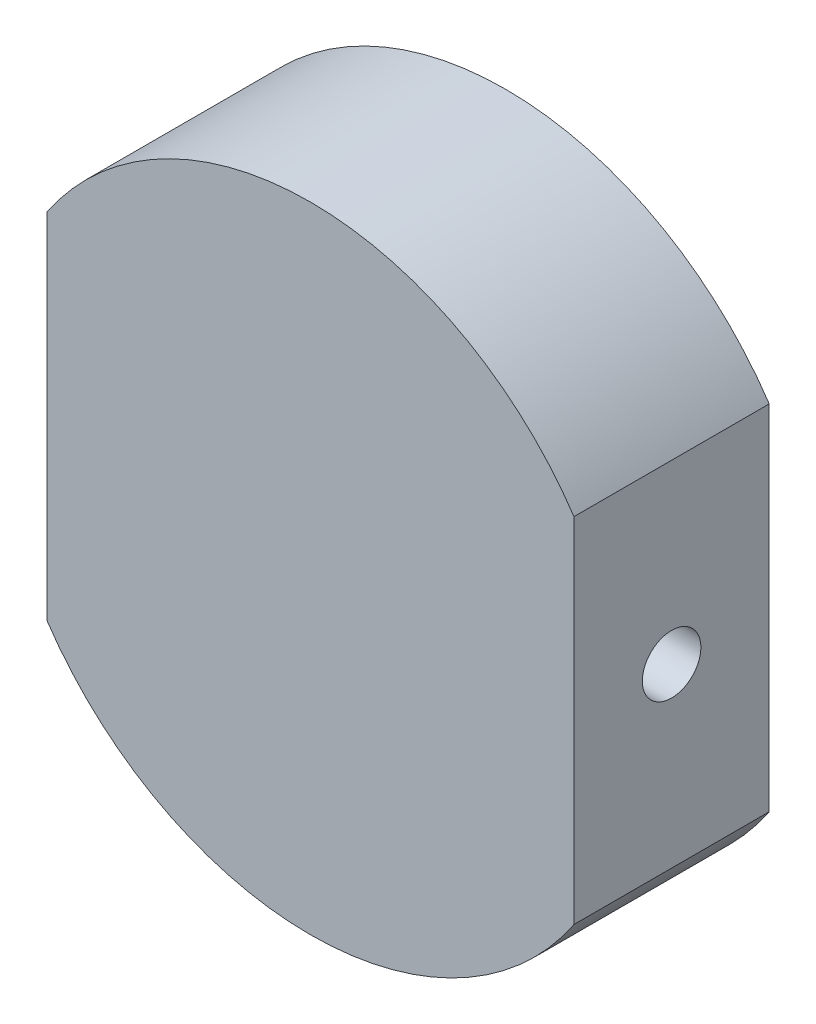
ISO-10303-21;
HEADER;
FILE_DESCRIPTION(('STEP AP214'),'2;1');
FILE_NAME('part.step','',(''),(''),'','','');
FILE_SCHEMA(('AUTOMOTIVE_DESIGN { 1 0 10303 214 1 1 1 1 }'));
ENDSEC;
DATA;
#1=APPLICATION_CONTEXT('core data for automotive mechanical design processes');
#2=APPLICATION_PROTOCOL_DEFINITION('international standard','automotive_design',2000,#1);
#3=PRODUCT_CONTEXT('',#1,'mechanical');
#4=PRODUCT('Part','Part','',(#3));
#5=PRODUCT_RELATED_PRODUCT_CATEGORY('part','',(#4));
#6=PRODUCT_DEFINITION_FORMATION('','',#4);
#7=PRODUCT_DEFINITION_CONTEXT('part definition',#1,'design');
#8=PRODUCT_DEFINITION('design','',#6,#7);
#9=PRODUCT_DEFINITION_SHAPE('','',#8);
#10=(LENGTH_UNIT() NAMED_UNIT(*) SI_UNIT(.MILLI.,.METRE.));
#11=(NAMED_UNIT(*) PLANE_ANGLE_UNIT() SI_UNIT($,.RADIAN.));
#12=(NAMED_UNIT(*) SI_UNIT($,.STERADIAN.) SOLID_ANGLE_UNIT());
#13=UNCERTAINTY_MEASURE_WITH_UNIT(LENGTH_MEASURE(1.E-05),#10,'distance_accuracy_value','');
#14=(GEOMETRIC_REPRESENTATION_CONTEXT(3) GLOBAL_UNCERTAINTY_ASSIGNED_CONTEXT((#13)) GLOBAL_UNIT_ASSIGNED_CONTEXT((#10,
#11,#12)) REPRESENTATION_CONTEXT('',''));
#15=CARTESIAN_POINT('',(0.,0.,0.));
#16=DIRECTION('',(0.,0.,1.));
#17=DIRECTION('',(1.,0.,0.));
#18=AXIS2_PLACEMENT_3D('',#15,#16,#17);
#19=CARTESIAN_POINT('',(0.,0.,20.));
#20=DIRECTION('',(0.,0.,-1.));
#21=DIRECTION('',(-1.,0.,0.));
#22=AXIS2_PLACEMENT_3D('',#19,#20,#21);
#23=CYLINDRICAL_SURFACE('',#22,32.5);
#24=CARTESIAN_POINT('',(0.,0.,20.));
#25=DIRECTION('',(0.,0.,1.));
#26=DIRECTION('',(1.,0.,0.));
#27=AXIS2_PLACEMENT_3D('',#24,#25,#26);
#28=CIRCLE('',#27,32.5);
#29=CARTESIAN_POINT('',(27.,18.0900525151255,20.));
#30=VERTEX_POINT('',#29);
#31=CARTESIAN_POINT('',(-27.,18.0900525151256,20.));
#32=VERTEX_POINT('',#31);
#33=EDGE_CURVE('E77',#30,#32,#28,.T.);
#34=ORIENTED_EDGE('',*,*,#33,.F.);
#35=DIRECTION('',(0.,0.,-1.));
#36=VECTOR('',#35,1.);
#37=CARTESIAN_POINT('',(27.,18.0900525151255,20.));
#38=LINE('',#37,#36);
#39=CARTESIAN_POINT('',(27.,18.0900525151255,0.));
#40=VERTEX_POINT('',#39);
#41=EDGE_CURVE('E71',#30,#40,#38,.T.);
#42=ORIENTED_EDGE('',*,*,#41,.T.);
#43=CARTESIAN_POINT('',(0.,0.,0.));
#44=DIRECTION('',(0.,0.,1.));
#45=DIRECTION('',(1.,0.,0.));
#46=AXIS2_PLACEMENT_3D('',#43,#44,#45);
#47=CIRCLE('',#46,32.5);
#48=CARTESIAN_POINT('',(-27.,18.0900525151255,0.));
#49=VERTEX_POINT('',#48);
#50=EDGE_CURVE('E53',#40,#49,#47,.T.);
#51=ORIENTED_EDGE('',*,*,#50,.T.);
#52=DIRECTION('',(0.,0.,-1.));
#53=VECTOR('',#52,1.);
#54=CARTESIAN_POINT('',(-27.,18.0900525151256,20.));
#55=LINE('',#54,#53);
#56=EDGE_CURVE('E97',#49,#32,#55,.F.);
#57=ORIENTED_EDGE('',*,*,#56,.T.);
#58=EDGE_LOOP('',(#34,#42,#51,#57));
#59=FACE_BOUND('',#58,.T.);
#60=ADVANCED_FACE('F31',(#59),#23,.T.);
#61=CARTESIAN_POINT('',(-27.,-18.0900525151255,0.));
#62=VERTEX_POINT('',#61);
#63=CARTESIAN_POINT('',(27.,-18.0900525151255,0.));
#64=VERTEX_POINT('',#63);
#65=EDGE_CURVE('E82',#62,#64,#47,.T.);
#66=ORIENTED_EDGE('',*,*,#65,.T.);
#67=DIRECTION('',(0.,0.,-1.));
#68=VECTOR('',#67,1.);
#69=CARTESIAN_POINT('',(27.,-18.0900525151255,20.));
#70=LINE('',#69,#68);
#71=CARTESIAN_POINT('',(27.,-18.0900525151255,20.));
#72=VERTEX_POINT('',#71);
#73=EDGE_CURVE('E46',#64,#72,#70,.F.);
#74=ORIENTED_EDGE('',*,*,#73,.T.);
#75=CARTESIAN_POINT('',(-27.,-18.0900525151256,20.));
#76=VERTEX_POINT('',#75);
#77=EDGE_CURVE('E89',#76,#72,#28,.T.);
#78=ORIENTED_EDGE('',*,*,#77,.F.);
#79=DIRECTION('',(0.,0.,-1.));
#80=VECTOR('',#79,1.);
#81=CARTESIAN_POINT('',(-27.,-18.0900525151256,20.));
#82=LINE('',#81,#80);
#83=EDGE_CURVE('E86',#76,#62,#82,.T.);
#84=ORIENTED_EDGE('',*,*,#83,.T.);
#85=EDGE_LOOP('',(#66,#74,#78,#84));
#86=FACE_BOUND('',#85,.T.);
#87=ADVANCED_FACE('F33',(#86),#23,.T.);
#88=CARTESIAN_POINT('',(0.,0.,20.));
#89=DIRECTION('',(0.,0.,1.));
#90=DIRECTION('',(1.,0.,0.));
#91=AXIS2_PLACEMENT_3D('',#88,#89,#90);
#92=PLANE('',#91);
#93=DIRECTION('',(0.,-1.,0.));
#94=VECTOR('',#93,1.);
#95=CARTESIAN_POINT('',(27.,0.,20.));
#96=LINE('',#95,#94);
#97=EDGE_CURVE('E78',#30,#72,#96,.T.);
#98=ORIENTED_EDGE('',*,*,#97,.F.);
#99=ORIENTED_EDGE('',*,*,#33,.T.);
#100=DIRECTION('',(0.,1.,0.));
#101=VECTOR('',#100,1.);
#102=CARTESIAN_POINT('',(-27.,0.,20.));
#103=LINE('',#102,#101);
#104=EDGE_CURVE('E83',#76,#32,#103,.T.);
#105=ORIENTED_EDGE('',*,*,#104,.F.);
#106=ORIENTED_EDGE('',*,*,#77,.T.);
#107=EDGE_LOOP('',(#98,#99,#105,#106));
#108=FACE_BOUND('',#107,.T.);
#109=ADVANCED_FACE('F94',(#108),#92,.T.);
#110=CARTESIAN_POINT('',(0.,0.,0.));
#111=DIRECTION('',(0.,0.,1.));
#112=DIRECTION('',(1.,0.,0.));
#113=AXIS2_PLACEMENT_3D('',#110,#111,#112);
#114=PLANE('',#113);
#115=ORIENTED_EDGE('',*,*,#50,.F.);
#116=DIRECTION('',(0.,-1.,0.));
#117=VECTOR('',#116,1.);
#118=CARTESIAN_POINT('',(27.,0.,0.));
#119=LINE('',#118,#117);
#120=EDGE_CURVE('E11',#40,#64,#119,.T.);
#121=ORIENTED_EDGE('',*,*,#120,.T.);
#122=ORIENTED_EDGE('',*,*,#65,.F.);
#123=DIRECTION('',(0.,1.,0.));
#124=VECTOR('',#123,1.);
#125=CARTESIAN_POINT('',(-27.,0.,0.));
#126=LINE('',#125,#124);
#127=EDGE_CURVE('E39',#62,#49,#126,.T.);
#128=ORIENTED_EDGE('',*,*,#127,.T.);
#129=EDGE_LOOP('',(#115,#121,#122,#128));
#130=FACE_BOUND('',#129,.T.);
#131=ADVANCED_FACE('F81',(#130),#114,.F.);
#132=CARTESIAN_POINT('',(-27.,-40.,-17.620999703109));
#133=DIRECTION('',(1.,0.,0.));
#134=DIRECTION('',(0.,0.,-1.));
#135=AXIS2_PLACEMENT_3D('',#132,#133,#134);
#136=PLANE('',#135);
#137=CARTESIAN_POINT('',(-27.,2.8421709430404E-11,10.));
#138=DIRECTION('',(1.,0.,0.));
#139=DIRECTION('',(0.,0.,-1.));
#140=AXIS2_PLACEMENT_3D('',#137,#138,#139);
#141=CIRCLE('',#140,3.);
#142=CARTESIAN_POINT('',(-27.,2.8421709430404E-11,7.));
#143=VERTEX_POINT('',#142);
#144=EDGE_CURVE('E104',#143,#143,#141,.T.);
#145=ORIENTED_EDGE('',*,*,#144,.T.);
#146=EDGE_LOOP('',(#145));
#147=FACE_BOUND('',#146,.T.);
#148=ORIENTED_EDGE('',*,*,#104,.T.);
#149=ORIENTED_EDGE('',*,*,#56,.F.);
#150=ORIENTED_EDGE('',*,*,#127,.F.);
#151=ORIENTED_EDGE('',*,*,#83,.F.);
#152=EDGE_LOOP('',(#148,#149,#150,#151));
#153=FACE_BOUND('',#152,.T.);
#154=ADVANCED_FACE('F96',(#147,#153),#136,.F.);
#155=CARTESIAN_POINT('',(27.,-40.,-17.620999703109));
#156=DIRECTION('',(-1.,0.,0.));
#157=DIRECTION('',(0.,0.,1.));
#158=AXIS2_PLACEMENT_3D('',#155,#156,#157);
#159=PLANE('',#158);
#160=CARTESIAN_POINT('',(27.,2.8421709430404E-11,9.99999999999999));
#161=DIRECTION('',(1.,0.,0.));
#162=DIRECTION('',(0.,0.,-1.));
#163=AXIS2_PLACEMENT_3D('',#160,#161,#162);
#164=CIRCLE('',#163,3.);
#165=CARTESIAN_POINT('',(27.,2.8421709430404E-11,6.99999999999999));
#166=VERTEX_POINT('',#165);
#167=EDGE_CURVE('E107',#166,#166,#164,.T.);
#168=ORIENTED_EDGE('',*,*,#167,.F.);
#169=EDGE_LOOP('',(#168));
#170=FACE_BOUND('',#169,.T.);
#171=ORIENTED_EDGE('',*,*,#97,.T.);
#172=ORIENTED_EDGE('',*,*,#73,.F.);
#173=ORIENTED_EDGE('',*,*,#120,.F.);
#174=ORIENTED_EDGE('',*,*,#41,.F.);
#175=EDGE_LOOP('',(#171,#172,#173,#174));
#176=FACE_BOUND('',#175,.T.);
#177=ADVANCED_FACE('F70',(#170,#176),#159,.F.);
#178=CARTESIAN_POINT('',(-33.,2.8421709430404E-11,10.));
#179=DIRECTION('',(1.,0.,0.));
#180=DIRECTION('',(0.,0.,-1.));
#181=AXIS2_PLACEMENT_3D('',#178,#179,#180);
#182=CYLINDRICAL_SURFACE('',#181,3.);
#183=CARTESIAN_POINT('',(27.,2.8421709430404E-11,6.99999999999999));
#184=CARTESIAN_POINT('',(26.4375,2.8421709430404E-11,6.99999999999999));
#185=CARTESIAN_POINT('',(25.875,2.8421709430404E-11,6.99999999999999));
#186=CARTESIAN_POINT('',(24.75,2.8421709430404E-11,6.99999999999999));
#187=CARTESIAN_POINT('',(24.1875,2.8421709430404E-11,6.99999999999999));
#188=CARTESIAN_POINT('',(23.0625,2.8421709430404E-11,6.99999999999999));
#189=CARTESIAN_POINT('',(22.5,2.8421709430404E-11,6.99999999999999));
#190=CARTESIAN_POINT('',(21.375,2.8421709430404E-11,6.99999999999999));
#191=CARTESIAN_POINT('',(20.8125,2.8421709430404E-11,6.99999999999999));
#192=CARTESIAN_POINT('',(19.6875,2.8421709430404E-11,6.99999999999999));
#193=CARTESIAN_POINT('',(19.125,2.8421709430404E-11,6.99999999999999));
#194=CARTESIAN_POINT('',(18.,2.8421709430404E-11,6.99999999999999));
#195=CARTESIAN_POINT('',(17.4375,2.8421709430404E-11,6.99999999999999));
#196=CARTESIAN_POINT('',(16.3125,2.8421709430404E-11,6.99999999999999));
#197=CARTESIAN_POINT('',(15.75,2.8421709430404E-11,6.99999999999999));
#198=CARTESIAN_POINT('',(14.625,2.8421709430404E-11,6.99999999999999));
#199=CARTESIAN_POINT('',(14.0625,2.8421709430404E-11,6.99999999999999));
#200=CARTESIAN_POINT('',(12.9375,2.8421709430404E-11,6.99999999999999));
#201=CARTESIAN_POINT('',(12.375,2.8421709430404E-11,6.99999999999999));
#202=CARTESIAN_POINT('',(11.25,2.8421709430404E-11,6.99999999999999));
#203=CARTESIAN_POINT('',(10.6875,2.8421709430404E-11,6.99999999999999));
#204=CARTESIAN_POINT('',(9.5625,2.8421709430404E-11,6.99999999999999));
#205=CARTESIAN_POINT('',(9.,2.8421709430404E-11,6.99999999999999));
#206=CARTESIAN_POINT('',(7.875,2.8421709430404E-11,6.99999999999999));
#207=CARTESIAN_POINT('',(7.3125,2.8421709430404E-11,6.99999999999999));
#208=CARTESIAN_POINT('',(6.1875,2.8421709430404E-11,6.99999999999999));
#209=CARTESIAN_POINT('',(5.625,2.8421709430404E-11,6.99999999999999));
#210=CARTESIAN_POINT('',(4.5,2.8421709430404E-11,6.99999999999999));
#211=CARTESIAN_POINT('',(3.9375,2.8421709430404E-11,6.99999999999999));
#212=CARTESIAN_POINT('',(2.8125,2.8421709430404E-11,6.99999999999999));
#213=CARTESIAN_POINT('',(2.25,2.8421709430404E-11,6.99999999999999));
#214=CARTESIAN_POINT('',(1.125,2.8421709430404E-11,6.99999999999999));
#215=CARTESIAN_POINT('',(0.562500000000001,2.8421709430404E-11,6.99999999999999));
#216=CARTESIAN_POINT('',(-0.562500000000001,2.8421709430404E-11,6.99999999999999));
#217=CARTESIAN_POINT('',(-1.125,2.8421709430404E-11,6.99999999999999));
#218=CARTESIAN_POINT('',(-2.25,2.8421709430404E-11,6.99999999999999));
#219=CARTESIAN_POINT('',(-2.8125,2.8421709430404E-11,6.99999999999999));
#220=CARTESIAN_POINT('',(-3.9375,2.8421709430404E-11,6.99999999999999));
#221=CARTESIAN_POINT('',(-4.49999999999999,2.8421709430404E-11,7.));
#222=CARTESIAN_POINT('',(-5.62499999999999,2.8421709430404E-11,7.));
#223=CARTESIAN_POINT('',(-6.18749999999999,2.8421709430404E-11,7.));
#224=CARTESIAN_POINT('',(-7.3125,2.8421709430404E-11,7.));
#225=CARTESIAN_POINT('',(-7.875,2.8421709430404E-11,7.));
#226=CARTESIAN_POINT('',(-9.,2.8421709430404E-11,7.));
#227=CARTESIAN_POINT('',(-9.5625,2.8421709430404E-11,7.));
#228=CARTESIAN_POINT('',(-10.6875,2.8421709430404E-11,7.));
#229=CARTESIAN_POINT('',(-11.25,2.8421709430404E-11,7.));
#230=CARTESIAN_POINT('',(-12.375,2.8421709430404E-11,7.));
#231=CARTESIAN_POINT('',(-12.9375,2.8421709430404E-11,7.));
#232=CARTESIAN_POINT('',(-14.0625,2.8421709430404E-11,7.));
#233=CARTESIAN_POINT('',(-14.625,2.8421709430404E-11,7.));
#234=CARTESIAN_POINT('',(-15.75,2.8421709430404E-11,7.));
#235=CARTESIAN_POINT('',(-16.3125,2.8421709430404E-11,7.));
#236=CARTESIAN_POINT('',(-17.4375,2.8421709430404E-11,7.));
#237=CARTESIAN_POINT('',(-18.,2.8421709430404E-11,7.));
#238=CARTESIAN_POINT('',(-19.125,2.8421709430404E-11,7.));
#239=CARTESIAN_POINT('',(-19.6875,2.8421709430404E-11,7.));
#240=CARTESIAN_POINT('',(-20.8125,2.8421709430404E-11,7.));
#241=CARTESIAN_POINT('',(-21.375,2.8421709430404E-11,7.));
#242=CARTESIAN_POINT('',(-22.5,2.8421709430404E-11,7.));
#243=CARTESIAN_POINT('',(-23.0625,2.8421709430404E-11,7.));
#244=CARTESIAN_POINT('',(-24.1875,2.8421709430404E-11,7.));
#245=CARTESIAN_POINT('',(-24.75,2.8421709430404E-11,7.));
#246=CARTESIAN_POINT('',(-25.875,2.8421709430404E-11,7.));
#247=CARTESIAN_POINT('',(-26.4375,2.8421709430404E-11,7.));
#248=CARTESIAN_POINT('',(-27.,2.8421709430404E-11,7.));
#249=B_SPLINE_CURVE_WITH_KNOTS('',3,(#183,#184,#185,#186,#187,#188,#189,#190,#191,#192,#193,
#194,#195,#196,#197,#198,#199,#200,#201,#202,#203,#204,#205,#206,#207,#208,#209,#210,#211,#212,
#213,#214,#215,#216,#217,#218,#219,#220,#221,#222,#223,#224,#225,#226,#227,#228,#229,#230,#231,
#232,#233,#234,#235,#236,#237,#238,#239,#240,#241,#242,#243,#244,#245,#246,#247,#248),
.UNSPECIFIED.,.F.,.F.,(4,2,2,2,2,2,2,2,2,2,2,2,2,2,2,2,2,2,2,2,2,2,2,2,2,2,2,2,2,2,2,2,4),(0.,
1.6875,3.375,5.0625,6.75,8.4375,10.125,11.8125,13.5,15.1875,16.875,18.5625,20.25,21.9375,23.625,
25.3125,27.,28.6875,30.375,32.0625,33.75,35.4375,37.125,38.8125,40.5,42.1875,43.875,45.5625,
47.25,48.9375,50.625,52.3125,54.),.UNSPECIFIED.);
#250=EDGE_CURVE('BSEAM111',#166,#143,#249,.T.);
#251=ORIENTED_EDGE('',*,*,#167,.T.);
#252=ORIENTED_EDGE('',*,*,#144,.F.);
#253=ORIENTED_EDGE('',*,*,#250,.T.);
#254=ORIENTED_EDGE('',*,*,#250,.F.);
#255=EDGE_LOOP('',(#251,#253,#252,#254));
#256=FACE_BOUND('',#255,.T.);
#257=ADVANCED_FACE('F111',(#256),#182,.F.);
#258=CLOSED_SHELL('',(#60,#87,#109,#131,#154,#177,#257));
#259=MANIFOLD_SOLID_BREP('B2',#258);
#260=ADVANCED_BREP_SHAPE_REPRESENTATION('',(#18,#259),#14);
#261=SHAPE_DEFINITION_REPRESENTATION(#9,#260);
ENDSEC;
END-ISO-10303-21;
